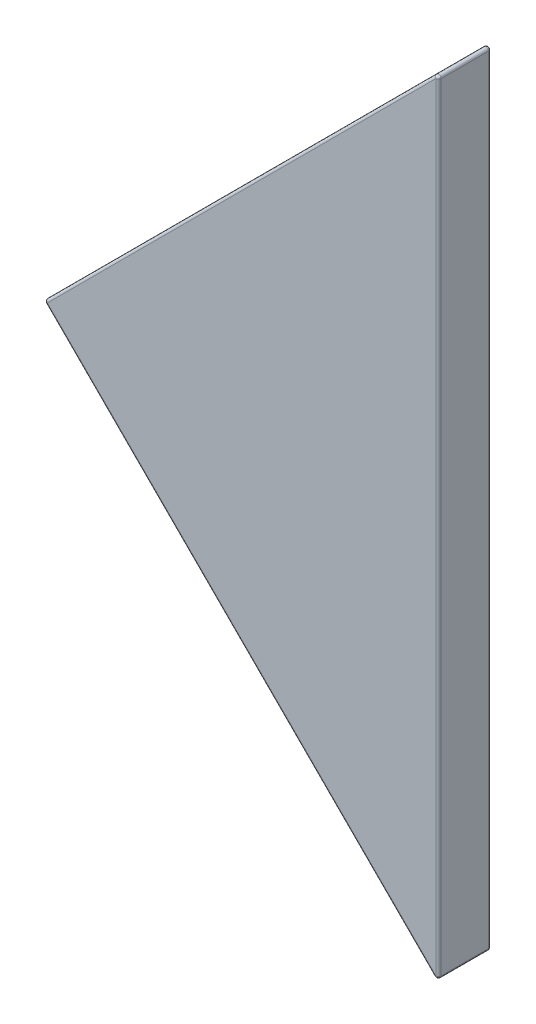
ISO-10303-21;
HEADER;
FILE_DESCRIPTION(('STEP AP214'),'2;1');
FILE_NAME('part.step','',(''),(''),'','','');
FILE_SCHEMA(('AUTOMOTIVE_DESIGN { 1 0 10303 214 1 1 1 1 }'));
ENDSEC;
DATA;
#1=APPLICATION_CONTEXT('core data for automotive mechanical design processes');
#2=APPLICATION_PROTOCOL_DEFINITION('international standard','automotive_design',2000,#1);
#3=PRODUCT_CONTEXT('',#1,'mechanical');
#4=PRODUCT('Part','Part','',(#3));
#5=PRODUCT_RELATED_PRODUCT_CATEGORY('part','',(#4));
#6=PRODUCT_DEFINITION_FORMATION('','',#4);
#7=PRODUCT_DEFINITION_CONTEXT('part definition',#1,'design');
#8=PRODUCT_DEFINITION('design','',#6,#7);
#9=PRODUCT_DEFINITION_SHAPE('','',#8);
#10=(LENGTH_UNIT() NAMED_UNIT(*) SI_UNIT(.MILLI.,.METRE.));
#11=(NAMED_UNIT(*) PLANE_ANGLE_UNIT() SI_UNIT($,.RADIAN.));
#12=(NAMED_UNIT(*) SI_UNIT($,.STERADIAN.) SOLID_ANGLE_UNIT());
#13=UNCERTAINTY_MEASURE_WITH_UNIT(LENGTH_MEASURE(1.E-05),#10,'distance_accuracy_value','');
#14=(GEOMETRIC_REPRESENTATION_CONTEXT(3) GLOBAL_UNCERTAINTY_ASSIGNED_CONTEXT((#13)) GLOBAL_UNIT_ASSIGNED_CONTEXT((#10,
#11,#12)) REPRESENTATION_CONTEXT('',''));
#15=CARTESIAN_POINT('',(0.,0.,0.));
#16=DIRECTION('',(0.,0.,1.));
#17=DIRECTION('',(1.,0.,0.));
#18=AXIS2_PLACEMENT_3D('',#15,#16,#17);
#19=CARTESIAN_POINT('',(-75.,75.0000000000008,10.));
#20=DIRECTION('',(0.707106781186544,-0.707106781186551,0.));
#21=DIRECTION('',(0.707106781186551,0.707106781186544,0.));
#22=AXIS2_PLACEMENT_3D('',#19,#20,#21);
#23=PLANE('',#22);
#24=DIRECTION('',(0.,0.,-1.));
#25=VECTOR('',#24,1.);
#26=CARTESIAN_POINT('',(-74.6464466094067,75.353553390594,10.));
#27=LINE('',#26,#25);
#28=CARTESIAN_POINT('',(-74.6464466094067,75.353553390594,0.5));
#29=VERTEX_POINT('',#28);
#30=CARTESIAN_POINT('',(-74.6464466094067,75.353553390594,9.5));
#31=VERTEX_POINT('',#30);
#32=EDGE_CURVE('E113',#29,#31,#27,.F.);
#33=ORIENTED_EDGE('',*,*,#32,.T.);
#34=DIRECTION('',(-0.707106781186551,-0.707106781186544,0.));
#35=VECTOR('',#34,1.);
#36=CARTESIAN_POINT('',(-75.,75.0000000000008,9.5));
#37=LINE('',#36,#35);
#38=CARTESIAN_POINT('',(-0.853553390593271,149.146446609407,9.5));
#39=VERTEX_POINT('',#38);
#40=EDGE_CURVE('E145',#31,#39,#37,.F.);
#41=ORIENTED_EDGE('',*,*,#40,.T.);
#42=DIRECTION('',(0.,0.,-1.));
#43=VECTOR('',#42,1.);
#44=CARTESIAN_POINT('',(-0.853553390593273,149.146446609407,10.));
#45=LINE('',#44,#43);
#46=CARTESIAN_POINT('',(-0.853553390593271,149.146446609407,0.5));
#47=VERTEX_POINT('',#46);
#48=EDGE_CURVE('E142',#39,#47,#45,.T.);
#49=ORIENTED_EDGE('',*,*,#48,.T.);
#50=DIRECTION('',(-0.707106781186551,-0.707106781186544,0.));
#51=VECTOR('',#50,1.);
#52=CARTESIAN_POINT('',(-75.,75.0000000000008,0.5));
#53=LINE('',#52,#51);
#54=EDGE_CURVE('E137',#47,#29,#53,.T.);
#55=ORIENTED_EDGE('',*,*,#54,.T.);
#56=EDGE_LOOP('',(#33,#41,#49,#55));
#57=FACE_BOUND('',#56,.T.);
#58=ADVANCED_FACE('F33',(#57),#23,.F.);
#59=CARTESIAN_POINT('',(-75.,75.0000000000008,10.));
#60=DIRECTION('',(0.707106781186551,0.707106781186544,0.));
#61=DIRECTION('',(-0.707106781186544,0.707106781186551,0.));
#62=AXIS2_PLACEMENT_3D('',#59,#60,#61);
#63=PLANE('',#62);
#64=DIRECTION('',(0.,0.,-1.));
#65=VECTOR('',#64,1.);
#66=CARTESIAN_POINT('',(-0.853553390593287,0.853553390593301,10.));
#67=LINE('',#66,#65);
#68=CARTESIAN_POINT('',(-0.853553390593274,0.853553390593283,0.5));
#69=VERTEX_POINT('',#68);
#70=CARTESIAN_POINT('',(-0.853553390593274,0.853553390593283,9.5));
#71=VERTEX_POINT('',#70);
#72=EDGE_CURVE('E130',#69,#71,#67,.F.);
#73=ORIENTED_EDGE('',*,*,#72,.T.);
#74=DIRECTION('',(0.707106781186544,-0.707106781186551,0.));
#75=VECTOR('',#74,1.);
#76=CARTESIAN_POINT('',(-75.,75.0000000000008,9.5));
#77=LINE('',#76,#75);
#78=CARTESIAN_POINT('',(-74.6464466094067,74.6464466094075,9.5));
#79=VERTEX_POINT('',#78);
#80=EDGE_CURVE('E134',#71,#79,#77,.F.);
#81=ORIENTED_EDGE('',*,*,#80,.T.);
#82=DIRECTION('',(0.,0.,-1.));
#83=VECTOR('',#82,1.);
#84=CARTESIAN_POINT('',(-74.6464466094067,74.6464466094075,10.));
#85=LINE('',#84,#83);
#86=CARTESIAN_POINT('',(-74.6464466094067,74.6464466094075,0.5));
#87=VERTEX_POINT('',#86);
#88=EDGE_CURVE('E111',#79,#87,#85,.T.);
#89=ORIENTED_EDGE('',*,*,#88,.T.);
#90=DIRECTION('',(0.707106781186544,-0.707106781186551,0.));
#91=VECTOR('',#90,1.);
#92=CARTESIAN_POINT('',(0.,0.,0.5));
#93=LINE('',#92,#91);
#94=EDGE_CURVE('E125',#87,#69,#93,.T.);
#95=ORIENTED_EDGE('',*,*,#94,.T.);
#96=EDGE_LOOP('',(#73,#81,#89,#95));
#97=FACE_BOUND('',#96,.T.);
#98=ADVANCED_FACE('F132',(#97),#63,.F.);
#99=CARTESIAN_POINT('',(0.,0.,10.));
#100=DIRECTION('',(-1.,0.,0.));
#101=DIRECTION('',(0.,0.,1.));
#102=AXIS2_PLACEMENT_3D('',#99,#100,#101);
#103=PLANE('',#102);
#104=DIRECTION('',(0.,0.,-1.));
#105=VECTOR('',#104,1.);
#106=CARTESIAN_POINT('',(0.,148.792893218813,10.));
#107=LINE('',#106,#105);
#108=CARTESIAN_POINT('',(0.,148.792893218813,0.5));
#109=VERTEX_POINT('',#108);
#110=CARTESIAN_POINT('',(0.,148.792893218813,9.5));
#111=VERTEX_POINT('',#110);
#112=EDGE_CURVE('E149',#109,#111,#107,.F.);
#113=ORIENTED_EDGE('',*,*,#112,.T.);
#114=DIRECTION('',(0.,1.,0.));
#115=VECTOR('',#114,1.);
#116=CARTESIAN_POINT('',(0.,0.,9.5));
#117=LINE('',#116,#115);
#118=CARTESIAN_POINT('',(0.,1.20710678118655,9.5));
#119=VERTEX_POINT('',#118);
#120=EDGE_CURVE('E154',#111,#119,#117,.F.);
#121=ORIENTED_EDGE('',*,*,#120,.T.);
#122=DIRECTION('',(0.,0.,-1.));
#123=VECTOR('',#122,1.);
#124=CARTESIAN_POINT('',(0.,1.20710678118655,10.));
#125=LINE('',#124,#123);
#126=CARTESIAN_POINT('',(0.,1.20710678118655,0.5));
#127=VERTEX_POINT('',#126);
#128=EDGE_CURVE('E151',#119,#127,#125,.T.);
#129=ORIENTED_EDGE('',*,*,#128,.T.);
#130=DIRECTION('',(0.,1.,0.));
#131=VECTOR('',#130,1.);
#132=CARTESIAN_POINT('',(0.,150.,0.5));
#133=LINE('',#132,#131);
#134=EDGE_CURVE('E147',#127,#109,#133,.T.);
#135=ORIENTED_EDGE('',*,*,#134,.T.);
#136=EDGE_LOOP('',(#113,#121,#129,#135));
#137=FACE_BOUND('',#136,.T.);
#138=ADVANCED_FACE('F229',(#137),#103,.F.);
#139=CARTESIAN_POINT('',(0.,0.,10.));
#140=DIRECTION('',(0.,0.,-1.));
#141=DIRECTION('',(-1.,0.,0.));
#142=AXIS2_PLACEMENT_3D('',#139,#140,#141);
#143=PLANE('',#142);
#144=DIRECTION('',(0.707106781186544,-0.707106781186551,0.));
#145=VECTOR('',#144,1.);
#146=CARTESIAN_POINT('',(0.353553390593276,0.353553390593272,10.));
#147=LINE('',#146,#145);
#148=CARTESIAN_POINT('',(-74.2928932188134,75.0000000000008,10.));
#149=VERTEX_POINT('',#148);
#150=CARTESIAN_POINT('',(-0.5,1.20710678118656,10.));
#151=VERTEX_POINT('',#150);
#152=EDGE_CURVE('E158',#149,#151,#147,.T.);
#153=ORIENTED_EDGE('',*,*,#152,.T.);
#154=DIRECTION('',(0.,1.,0.));
#155=VECTOR('',#154,1.);
#156=CARTESIAN_POINT('',(-0.5,0.,10.));
#157=LINE('',#156,#155);
#158=CARTESIAN_POINT('',(-0.5,148.792893218813,10.));
#159=VERTEX_POINT('',#158);
#160=EDGE_CURVE('E160',#151,#159,#157,.T.);
#161=ORIENTED_EDGE('',*,*,#160,.T.);
#162=DIRECTION('',(-0.707106781186551,-0.707106781186544,0.));
#163=VECTOR('',#162,1.);
#164=CARTESIAN_POINT('',(-74.6464466094067,74.6464466094075,10.));
#165=LINE('',#164,#163);
#166=EDGE_CURVE('E156',#159,#149,#165,.T.);
#167=ORIENTED_EDGE('',*,*,#166,.T.);
#168=EDGE_LOOP('',(#153,#161,#167));
#169=FACE_BOUND('',#168,.T.);
#170=ADVANCED_FACE('F215',(#169),#143,.F.);
#171=CARTESIAN_POINT('',(0.,0.,0.));
#172=DIRECTION('',(0.,0.,-1.));
#173=DIRECTION('',(-1.,0.,0.));
#174=AXIS2_PLACEMENT_3D('',#171,#172,#173);
#175=PLANE('',#174);
#176=DIRECTION('',(-0.707106781186551,-0.707106781186544,0.));
#177=VECTOR('',#176,1.);
#178=CARTESIAN_POINT('',(0.353553390593273,149.646446609407,0.));
#179=LINE('',#178,#177);
#180=CARTESIAN_POINT('',(-74.2928932188134,75.0000000000008,0.));
#181=VERTEX_POINT('',#180);
#182=CARTESIAN_POINT('',(-0.499999999999998,148.792893218813,0.));
#183=VERTEX_POINT('',#182);
#184=EDGE_CURVE('E55',#181,#183,#179,.F.);
#185=ORIENTED_EDGE('',*,*,#184,.T.);
#186=DIRECTION('',(0.,1.,0.));
#187=VECTOR('',#186,1.);
#188=CARTESIAN_POINT('',(-0.5,0.,0.));
#189=LINE('',#188,#187);
#190=CARTESIAN_POINT('',(-0.5,1.20710678118656,0.));
#191=VERTEX_POINT('',#190);
#192=EDGE_CURVE('E11',#183,#191,#189,.F.);
#193=ORIENTED_EDGE('',*,*,#192,.T.);
#194=DIRECTION('',(0.707106781186544,-0.707106781186551,0.));
#195=VECTOR('',#194,1.);
#196=CARTESIAN_POINT('',(-74.6464466094067,75.353553390594,0.));
#197=LINE('',#196,#195);
#198=EDGE_CURVE('E42',#191,#181,#197,.F.);
#199=ORIENTED_EDGE('',*,*,#198,.T.);
#200=EDGE_LOOP('',(#185,#193,#199));
#201=FACE_BOUND('',#200,.T.);
#202=ADVANCED_FACE('F288',(#201),#175,.T.);
#203=CARTESIAN_POINT('',(-0.5,0.,9.5));
#204=DIRECTION('',(0.,1.,0.));
#205=DIRECTION('',(0.,0.,1.));
#206=AXIS2_PLACEMENT_3D('',#203,#204,#205);
#207=CYLINDRICAL_SURFACE('',#206,0.5);
#208=CARTESIAN_POINT('',(-0.5,1.20710678118655,9.5));
#209=DIRECTION('',(0.,-1.,0.));
#210=DIRECTION('',(0.,0.,-1.));
#211=AXIS2_PLACEMENT_3D('',#208,#209,#210);
#212=CIRCLE('',#211,0.5);
#213=EDGE_CURVE('E196',#119,#151,#212,.T.);
#214=ORIENTED_EDGE('',*,*,#213,.F.);
#215=ORIENTED_EDGE('',*,*,#120,.F.);
#216=CARTESIAN_POINT('',(-0.5,148.792893218813,9.5));
#217=DIRECTION('',(0.,1.,0.));
#218=DIRECTION('',(0.,0.,1.));
#219=AXIS2_PLACEMENT_3D('',#216,#217,#218);
#220=CIRCLE('',#219,0.5);
#221=EDGE_CURVE('E198',#159,#111,#220,.T.);
#222=ORIENTED_EDGE('',*,*,#221,.F.);
#223=ORIENTED_EDGE('',*,*,#160,.F.);
#224=EDGE_LOOP('',(#214,#215,#222,#223));
#225=FACE_BOUND('',#224,.T.);
#226=ADVANCED_FACE('F35',(#225),#207,.T.);
#227=CARTESIAN_POINT('',(-0.5,1.20710678118655,10.));
#228=DIRECTION('',(0.,0.,-1.));
#229=DIRECTION('',(-1.,0.,0.));
#230=AXIS2_PLACEMENT_3D('',#227,#228,#229);
#231=CYLINDRICAL_SURFACE('',#230,0.5);
#232=CARTESIAN_POINT('',(-0.5,1.20710678118655,0.5));
#233=DIRECTION('',(0.,0.,-1.));
#234=DIRECTION('',(-1.,0.,0.));
#235=AXIS2_PLACEMENT_3D('',#232,#233,#234);
#236=CIRCLE('',#235,0.5);
#237=EDGE_CURVE('E190',#127,#69,#236,.T.);
#238=ORIENTED_EDGE('',*,*,#237,.F.);
#239=ORIENTED_EDGE('',*,*,#128,.F.);
#240=CARTESIAN_POINT('',(-0.499999999999998,1.20710678118655,9.5));
#241=DIRECTION('',(0.,0.,1.));
#242=DIRECTION('',(1.,0.,0.));
#243=AXIS2_PLACEMENT_3D('',#240,#241,#242);
#244=CIRCLE('',#243,0.5);
#245=EDGE_CURVE('E193',#71,#119,#244,.T.);
#246=ORIENTED_EDGE('',*,*,#245,.F.);
#247=ORIENTED_EDGE('',*,*,#72,.F.);
#248=EDGE_LOOP('',(#238,#239,#246,#247));
#249=FACE_BOUND('',#248,.T.);
#250=ADVANCED_FACE('F232',(#249),#231,.T.);
#251=CARTESIAN_POINT('',(-0.5,0.,0.5));
#252=DIRECTION('',(0.,-1.,0.));
#253=DIRECTION('',(0.,0.,-1.));
#254=AXIS2_PLACEMENT_3D('',#251,#252,#253);
#255=CYLINDRICAL_SURFACE('',#254,0.5);
#256=CARTESIAN_POINT('',(-0.5,148.792893218813,0.5));
#257=DIRECTION('',(0.,1.,0.));
#258=DIRECTION('',(0.,0.,1.));
#259=AXIS2_PLACEMENT_3D('',#256,#257,#258);
#260=CIRCLE('',#259,0.5);
#261=EDGE_CURVE('E185',#109,#183,#260,.T.);
#262=ORIENTED_EDGE('',*,*,#261,.F.);
#263=ORIENTED_EDGE('',*,*,#134,.F.);
#264=CARTESIAN_POINT('',(-0.5,1.20710678118656,0.5));
#265=DIRECTION('',(0.,-1.,0.));
#266=DIRECTION('',(1.,0.,0.));
#267=AXIS2_PLACEMENT_3D('',#264,#265,#266);
#268=CIRCLE('',#267,0.5);
#269=EDGE_CURVE('E188',#191,#127,#268,.T.);
#270=ORIENTED_EDGE('',*,*,#269,.F.);
#271=ORIENTED_EDGE('',*,*,#192,.F.);
#272=EDGE_LOOP('',(#262,#263,#270,#271));
#273=FACE_BOUND('',#272,.T.);
#274=ADVANCED_FACE('F238',(#273),#255,.T.);
#275=CARTESIAN_POINT('',(-0.5,148.792893218813,10.));
#276=DIRECTION('',(0.,0.,-1.));
#277=DIRECTION('',(-1.,0.,0.));
#278=AXIS2_PLACEMENT_3D('',#275,#276,#277);
#279=CYLINDRICAL_SURFACE('',#278,0.5);
#280=CARTESIAN_POINT('',(-0.5,148.792893218813,9.5));
#281=DIRECTION('',(0.,0.,1.));
#282=DIRECTION('',(1.,0.,0.));
#283=AXIS2_PLACEMENT_3D('',#280,#281,#282);
#284=CIRCLE('',#283,0.5);
#285=EDGE_CURVE('E37',#111,#39,#284,.T.);
#286=ORIENTED_EDGE('',*,*,#285,.F.);
#287=ORIENTED_EDGE('',*,*,#112,.F.);
#288=CARTESIAN_POINT('',(-0.499999999999999,148.792893218813,0.5));
#289=DIRECTION('',(0.,0.,-1.));
#290=DIRECTION('',(-1.,0.,0.));
#291=AXIS2_PLACEMENT_3D('',#288,#289,#290);
#292=CIRCLE('',#291,0.5);
#293=EDGE_CURVE('E182',#47,#109,#292,.T.);
#294=ORIENTED_EDGE('',*,*,#293,.F.);
#295=ORIENTED_EDGE('',*,*,#48,.F.);
#296=EDGE_LOOP('',(#286,#287,#294,#295));
#297=FACE_BOUND('',#296,.T.);
#298=ADVANCED_FACE('F240',(#297),#279,.T.);
#299=CARTESIAN_POINT('',(-0.5,148.792893218813,9.5));
#300=DIRECTION('',(0.,0.,1.));
#301=DIRECTION('',(1.,0.,0.));
#302=AXIS2_PLACEMENT_3D('',#299,#300,#301);
#303=SPHERICAL_SURFACE('',#302,0.5);
#304=ORIENTED_EDGE('',*,*,#221,.T.);
#305=ORIENTED_EDGE('',*,*,#285,.T.);
#306=CARTESIAN_POINT('',(-0.499999999999999,148.792893218813,9.5));
#307=DIRECTION('',(0.707106781186562,0.707106781186533,0.));
#308=DIRECTION('',(-0.707106781186533,0.707106781186562,0.));
#309=AXIS2_PLACEMENT_3D('',#306,#307,#308);
#310=CIRCLE('',#309,0.5);
#311=EDGE_CURVE('E179',#159,#39,#310,.F.);
#312=ORIENTED_EDGE('',*,*,#311,.F.);
#313=EDGE_LOOP('',(#304,#305,#312));
#314=FACE_BOUND('',#313,.T.);
#315=ADVANCED_FACE('F205',(#314),#303,.T.);
#316=CARTESIAN_POINT('',(-0.5,1.20710678118656,9.5));
#317=DIRECTION('',(0.,0.,1.));
#318=DIRECTION('',(1.,0.,0.));
#319=AXIS2_PLACEMENT_3D('',#316,#317,#318);
#320=SPHERICAL_SURFACE('',#319,0.5);
#321=ORIENTED_EDGE('',*,*,#245,.T.);
#322=ORIENTED_EDGE('',*,*,#213,.T.);
#323=CARTESIAN_POINT('',(-0.5,1.20710678118656,9.5));
#324=DIRECTION('',(0.707106781186548,-0.707106781186547,0.));
#325=DIRECTION('',(0.707106781186547,0.707106781186548,0.));
#326=AXIS2_PLACEMENT_3D('',#323,#324,#325);
#327=CIRCLE('',#326,0.5);
#328=EDGE_CURVE('E176',#71,#151,#327,.F.);
#329=ORIENTED_EDGE('',*,*,#328,.F.);
#330=EDGE_LOOP('',(#321,#322,#329));
#331=FACE_BOUND('',#330,.T.);
#332=ADVANCED_FACE('F222',(#331),#320,.T.);
#333=CARTESIAN_POINT('',(-0.5,1.20710678118656,0.5));
#334=DIRECTION('',(0.,0.,1.));
#335=DIRECTION('',(1.,0.,0.));
#336=AXIS2_PLACEMENT_3D('',#333,#334,#335);
#337=SPHERICAL_SURFACE('',#336,0.5);
#338=ORIENTED_EDGE('',*,*,#269,.T.);
#339=ORIENTED_EDGE('',*,*,#237,.T.);
#340=CARTESIAN_POINT('',(-0.499999999999998,1.20710678118655,0.5));
#341=DIRECTION('',(0.707106781186544,-0.707106781186551,0.));
#342=DIRECTION('',(0.707106781186551,0.707106781186544,0.));
#343=AXIS2_PLACEMENT_3D('',#340,#341,#342);
#344=CIRCLE('',#343,0.5);
#345=EDGE_CURVE('E127',#191,#69,#344,.F.);
#346=ORIENTED_EDGE('',*,*,#345,.F.);
#347=EDGE_LOOP('',(#338,#339,#346));
#348=FACE_BOUND('',#347,.T.);
#349=ADVANCED_FACE('F274',(#348),#337,.T.);
#350=CARTESIAN_POINT('',(-0.5,148.792893218813,0.5));
#351=DIRECTION('',(0.,0.,1.));
#352=DIRECTION('',(1.,0.,0.));
#353=AXIS2_PLACEMENT_3D('',#350,#351,#352);
#354=SPHERICAL_SURFACE('',#353,0.5);
#355=ORIENTED_EDGE('',*,*,#293,.T.);
#356=ORIENTED_EDGE('',*,*,#261,.T.);
#357=CARTESIAN_POINT('',(-0.499999999999998,148.792893218813,0.5));
#358=DIRECTION('',(0.707106781186532,0.707106781186563,0.));
#359=DIRECTION('',(-0.707106781186563,0.707106781186532,0.));
#360=AXIS2_PLACEMENT_3D('',#357,#358,#359);
#361=CIRCLE('',#360,0.5);
#362=EDGE_CURVE('E172',#47,#183,#361,.F.);
#363=ORIENTED_EDGE('',*,*,#362,.F.);
#364=EDGE_LOOP('',(#355,#356,#363));
#365=FACE_BOUND('',#364,.T.);
#366=ADVANCED_FACE('F244',(#365),#354,.T.);
#367=CARTESIAN_POINT('',(-74.6464466094067,74.6464466094075,9.5));
#368=DIRECTION('',(-0.707106781186551,-0.707106781186544,0.));
#369=DIRECTION('',(0.707106781186544,-0.707106781186551,0.));
#370=AXIS2_PLACEMENT_3D('',#367,#368,#369);
#371=CYLINDRICAL_SURFACE('',#370,0.5);
#372=ORIENTED_EDGE('',*,*,#311,.T.);
#373=ORIENTED_EDGE('',*,*,#40,.F.);
#374=CARTESIAN_POINT('',(-74.2928932188134,75.0000000000008,9.5));
#375=DIRECTION('',(-0.707106781186547,-0.707106781186547,0.));
#376=DIRECTION('',(0.707106781186548,-0.707106781186548,0.));
#377=AXIS2_PLACEMENT_3D('',#374,#375,#376);
#378=CIRCLE('',#377,0.5);
#379=EDGE_CURVE('E169',#149,#31,#378,.T.);
#380=ORIENTED_EDGE('',*,*,#379,.F.);
#381=ORIENTED_EDGE('',*,*,#166,.F.);
#382=EDGE_LOOP('',(#372,#373,#380,#381));
#383=FACE_BOUND('',#382,.T.);
#384=ADVANCED_FACE('F211',(#383),#371,.T.);
#385=CARTESIAN_POINT('',(0.353553390593276,0.353553390593272,9.5));
#386=DIRECTION('',(0.707106781186544,-0.707106781186551,0.));
#387=DIRECTION('',(0.707106781186551,0.707106781186544,0.));
#388=AXIS2_PLACEMENT_3D('',#385,#386,#387);
#389=CYLINDRICAL_SURFACE('',#388,0.5);
#390=ORIENTED_EDGE('',*,*,#328,.T.);
#391=ORIENTED_EDGE('',*,*,#152,.F.);
#392=CARTESIAN_POINT('',(-74.2928932188134,75.0000000000008,9.5));
#393=DIRECTION('',(-0.707106781186547,0.707106781186547,0.));
#394=DIRECTION('',(-0.707106781186548,-0.707106781186548,0.));
#395=AXIS2_PLACEMENT_3D('',#392,#393,#394);
#396=CIRCLE('',#395,0.5);
#397=EDGE_CURVE('E123',#79,#149,#396,.T.);
#398=ORIENTED_EDGE('',*,*,#397,.F.);
#399=ORIENTED_EDGE('',*,*,#80,.F.);
#400=EDGE_LOOP('',(#390,#391,#398,#399));
#401=FACE_BOUND('',#400,.T.);
#402=ADVANCED_FACE('F218',(#401),#389,.T.);
#403=CARTESIAN_POINT('',(-74.6464466094067,75.353553390594,0.5));
#404=DIRECTION('',(-0.707106781186544,0.707106781186551,0.));
#405=DIRECTION('',(-0.707106781186551,-0.707106781186544,0.));
#406=AXIS2_PLACEMENT_3D('',#403,#404,#405);
#407=CYLINDRICAL_SURFACE('',#406,0.5);
#408=ORIENTED_EDGE('',*,*,#345,.T.);
#409=ORIENTED_EDGE('',*,*,#94,.F.);
#410=CARTESIAN_POINT('',(-74.2928932188134,75.0000000000008,0.5));
#411=DIRECTION('',(-0.707106781186548,0.707106781186548,0.));
#412=DIRECTION('',(-0.707106781186548,-0.707106781186548,0.));
#413=AXIS2_PLACEMENT_3D('',#410,#411,#412);
#414=CIRCLE('',#413,0.5);
#415=EDGE_CURVE('E118',#181,#87,#414,.T.);
#416=ORIENTED_EDGE('',*,*,#415,.F.);
#417=ORIENTED_EDGE('',*,*,#198,.F.);
#418=EDGE_LOOP('',(#408,#409,#416,#417));
#419=FACE_BOUND('',#418,.T.);
#420=ADVANCED_FACE('F126',(#419),#407,.T.);
#421=CARTESIAN_POINT('',(-74.6464466094067,74.6464466094075,0.5));
#422=DIRECTION('',(0.707106781186551,0.707106781186544,0.));
#423=DIRECTION('',(-0.707106781186544,0.707106781186551,0.));
#424=AXIS2_PLACEMENT_3D('',#421,#422,#423);
#425=CYLINDRICAL_SURFACE('',#424,0.5);
#426=ORIENTED_EDGE('',*,*,#362,.T.);
#427=ORIENTED_EDGE('',*,*,#184,.F.);
#428=CARTESIAN_POINT('',(-74.2928932188134,75.0000000000008,0.5));
#429=DIRECTION('',(-0.707106781186547,-0.707106781186547,0.));
#430=DIRECTION('',(0.707106781186548,-0.707106781186548,0.));
#431=AXIS2_PLACEMENT_3D('',#428,#429,#430);
#432=CIRCLE('',#431,0.5);
#433=EDGE_CURVE('E122',#29,#181,#432,.T.);
#434=ORIENTED_EDGE('',*,*,#433,.F.);
#435=ORIENTED_EDGE('',*,*,#54,.F.);
#436=EDGE_LOOP('',(#426,#427,#434,#435));
#437=FACE_BOUND('',#436,.T.);
#438=ADVANCED_FACE('F246',(#437),#425,.T.);
#439=CARTESIAN_POINT('',(-74.2928932188134,75.0000000000008,9.5));
#440=DIRECTION('',(0.,0.,1.));
#441=DIRECTION('',(1.,0.,0.));
#442=AXIS2_PLACEMENT_3D('',#439,#440,#441);
#443=SPHERICAL_SURFACE('',#442,0.5);
#444=ORIENTED_EDGE('',*,*,#397,.T.);
#445=ORIENTED_EDGE('',*,*,#379,.T.);
#446=CARTESIAN_POINT('',(-74.2928932188134,75.0000000000008,9.5));
#447=DIRECTION('',(0.,0.,1.));
#448=DIRECTION('',(1.,0.,0.));
#449=AXIS2_PLACEMENT_3D('',#446,#447,#448);
#450=CIRCLE('',#449,0.5);
#451=EDGE_CURVE('E116',#79,#31,#450,.F.);
#452=ORIENTED_EDGE('',*,*,#451,.F.);
#453=EDGE_LOOP('',(#444,#445,#452));
#454=FACE_BOUND('',#453,.T.);
#455=ADVANCED_FACE('F260',(#454),#443,.T.);
#456=CARTESIAN_POINT('',(-74.2928932188134,75.0000000000008,0.5));
#457=DIRECTION('',(0.,0.,1.));
#458=DIRECTION('',(1.,0.,0.));
#459=AXIS2_PLACEMENT_3D('',#456,#457,#458);
#460=SPHERICAL_SURFACE('',#459,0.5);
#461=ORIENTED_EDGE('',*,*,#433,.T.);
#462=ORIENTED_EDGE('',*,*,#415,.T.);
#463=CARTESIAN_POINT('',(-74.2928932188134,75.0000000000008,0.5));
#464=DIRECTION('',(0.,0.,-1.));
#465=DIRECTION('',(-1.,0.,0.));
#466=AXIS2_PLACEMENT_3D('',#463,#464,#465);
#467=CIRCLE('',#466,0.5);
#468=EDGE_CURVE('E107',#29,#87,#467,.F.);
#469=ORIENTED_EDGE('',*,*,#468,.F.);
#470=EDGE_LOOP('',(#461,#462,#469));
#471=FACE_BOUND('',#470,.T.);
#472=ADVANCED_FACE('F120',(#471),#460,.T.);
#473=CARTESIAN_POINT('',(-74.2928932188134,75.0000000000008,10.));
#474=DIRECTION('',(0.,0.,-1.));
#475=DIRECTION('',(-1.,0.,0.));
#476=AXIS2_PLACEMENT_3D('',#473,#474,#475);
#477=CYLINDRICAL_SURFACE('',#476,0.5);
#478=ORIENTED_EDGE('',*,*,#451,.T.);
#479=ORIENTED_EDGE('',*,*,#32,.F.);
#480=ORIENTED_EDGE('',*,*,#468,.T.);
#481=ORIENTED_EDGE('',*,*,#88,.F.);
#482=EDGE_LOOP('',(#478,#479,#480,#481));
#483=FACE_BOUND('',#482,.T.);
#484=ADVANCED_FACE('F109',(#483),#477,.T.);
#485=CLOSED_SHELL('',(#58,#98,#138,#170,#202,#226,#250,#274,#298,#315,#332,#349,#366,#384,#402,
#420,#438,#455,#472,#484));
#486=MANIFOLD_SOLID_BREP('B2',#485);
#487=ADVANCED_BREP_SHAPE_REPRESENTATION('',(#18,#486),#14);
#488=SHAPE_DEFINITION_REPRESENTATION(#9,#487);
ENDSEC;
END-ISO-10303-21;
